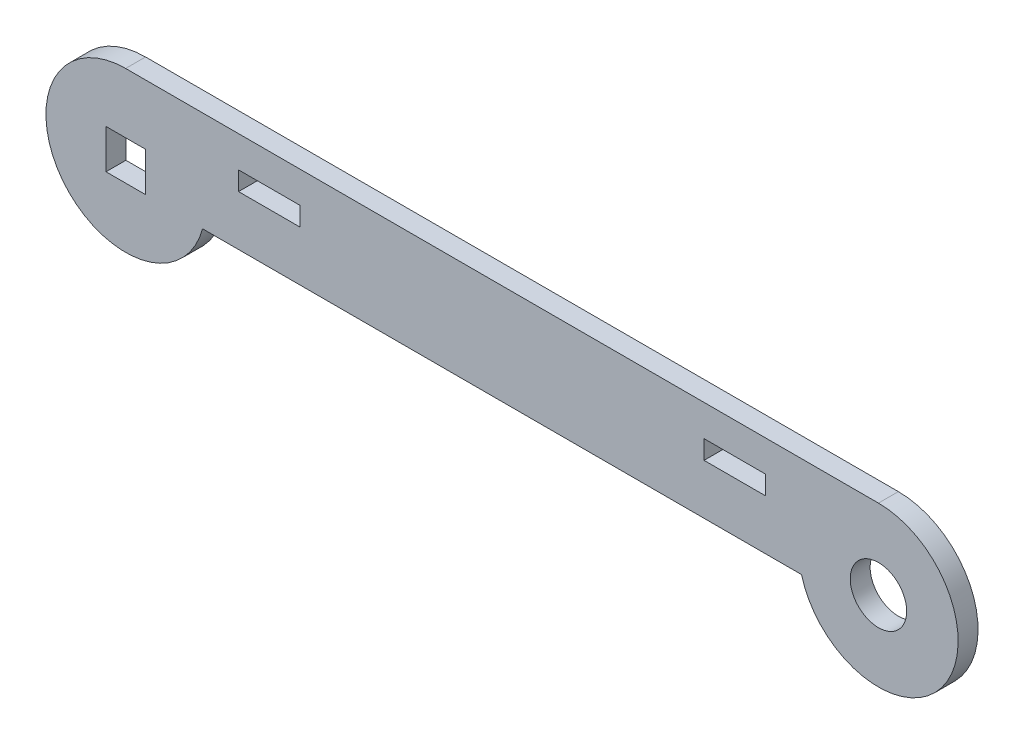
ISO-10303-21;
HEADER;
FILE_DESCRIPTION(('STEP AP214'),'2;1');
FILE_NAME('part.step','',(''),(''),'','','');
FILE_SCHEMA(('AUTOMOTIVE_DESIGN { 1 0 10303 214 1 1 1 1 }'));
ENDSEC;
DATA;
#1=APPLICATION_CONTEXT('core data for automotive mechanical design processes');
#2=APPLICATION_PROTOCOL_DEFINITION('international standard','automotive_design',2000,#1);
#3=PRODUCT_CONTEXT('',#1,'mechanical');
#4=PRODUCT('Part','Part','',(#3));
#5=PRODUCT_RELATED_PRODUCT_CATEGORY('part','',(#4));
#6=PRODUCT_DEFINITION_FORMATION('','',#4);
#7=PRODUCT_DEFINITION_CONTEXT('part definition',#1,'design');
#8=PRODUCT_DEFINITION('design','',#6,#7);
#9=PRODUCT_DEFINITION_SHAPE('','',#8);
#10=(LENGTH_UNIT() NAMED_UNIT(*) SI_UNIT(.MILLI.,.METRE.));
#11=(NAMED_UNIT(*) PLANE_ANGLE_UNIT() SI_UNIT($,.RADIAN.));
#12=(NAMED_UNIT(*) SI_UNIT($,.STERADIAN.) SOLID_ANGLE_UNIT());
#13=UNCERTAINTY_MEASURE_WITH_UNIT(LENGTH_MEASURE(1.E-05),#10,'distance_accuracy_value','');
#14=(GEOMETRIC_REPRESENTATION_CONTEXT(3) GLOBAL_UNCERTAINTY_ASSIGNED_CONTEXT((#13)) GLOBAL_UNIT_ASSIGNED_CONTEXT((#10,
#11,#12)) REPRESENTATION_CONTEXT('',''));
#15=CARTESIAN_POINT('',(0.,0.,0.));
#16=DIRECTION('',(0.,0.,1.));
#17=DIRECTION('',(1.,0.,0.));
#18=AXIS2_PLACEMENT_3D('',#15,#16,#17);
#19=CARTESIAN_POINT('',(1.565,0.,1.5875));
#20=DIRECTION('',(-1.,0.,0.));
#21=DIRECTION('',(0.,0.,1.));
#22=AXIS2_PLACEMENT_3D('',#19,#20,#21);
#23=PLANE('',#22);
#24=DIRECTION('',(0.,1.,0.));
#25=VECTOR('',#24,1.);
#26=CARTESIAN_POINT('',(1.565,0.,0.));
#27=LINE('',#26,#25);
#28=CARTESIAN_POINT('',(1.565,-1.565,0.));
#29=VERTEX_POINT('',#28);
#30=CARTESIAN_POINT('',(1.565,1.565,0.));
#31=VERTEX_POINT('',#30);
#32=EDGE_CURVE('E225',#29,#31,#27,.T.);
#33=ORIENTED_EDGE('',*,*,#32,.F.);
#34=DIRECTION('',(0.,0.,-1.));
#35=VECTOR('',#34,1.);
#36=CARTESIAN_POINT('',(1.565,-1.565,1.5875));
#37=LINE('',#36,#35);
#38=CARTESIAN_POINT('',(1.565,-1.565,1.5875));
#39=VERTEX_POINT('',#38);
#40=EDGE_CURVE('E11',#39,#29,#37,.T.);
#41=ORIENTED_EDGE('',*,*,#40,.F.);
#42=DIRECTION('',(0.,1.,0.));
#43=VECTOR('',#42,1.);
#44=CARTESIAN_POINT('',(1.565,0.,1.5875));
#45=LINE('',#44,#43);
#46=CARTESIAN_POINT('',(1.565,1.565,1.5875));
#47=VERTEX_POINT('',#46);
#48=EDGE_CURVE('E179',#39,#47,#45,.T.);
#49=ORIENTED_EDGE('',*,*,#48,.T.);
#50=DIRECTION('',(0.,0.,-1.));
#51=VECTOR('',#50,1.);
#52=CARTESIAN_POINT('',(1.565,1.565,1.5875));
#53=LINE('',#52,#51);
#54=EDGE_CURVE('E115',#47,#31,#53,.T.);
#55=ORIENTED_EDGE('',*,*,#54,.T.);
#56=EDGE_LOOP('',(#33,#41,#49,#55));
#57=FACE_BOUND('',#56,.T.);
#58=ADVANCED_FACE('F37',(#57),#23,.T.);
#59=CARTESIAN_POINT('',(0.,-1.565,1.5875));
#60=DIRECTION('',(0.,1.,0.));
#61=DIRECTION('',(0.,0.,1.));
#62=AXIS2_PLACEMENT_3D('',#59,#60,#61);
#63=PLANE('',#62);
#64=DIRECTION('',(1.,0.,0.));
#65=VECTOR('',#64,1.);
#66=CARTESIAN_POINT('',(0.,-1.565,0.));
#67=LINE('',#66,#65);
#68=CARTESIAN_POINT('',(-1.565,-1.565,0.));
#69=VERTEX_POINT('',#68);
#70=EDGE_CURVE('E168',#69,#29,#67,.T.);
#71=ORIENTED_EDGE('',*,*,#70,.F.);
#72=DIRECTION('',(0.,0.,-1.));
#73=VECTOR('',#72,1.);
#74=CARTESIAN_POINT('',(-1.565,-1.565,1.5875));
#75=LINE('',#74,#73);
#76=CARTESIAN_POINT('',(-1.565,-1.565,1.5875));
#77=VERTEX_POINT('',#76);
#78=EDGE_CURVE('E47',#77,#69,#75,.T.);
#79=ORIENTED_EDGE('',*,*,#78,.F.);
#80=DIRECTION('',(1.,0.,0.));
#81=VECTOR('',#80,1.);
#82=CARTESIAN_POINT('',(0.,-1.565,1.5875));
#83=LINE('',#82,#81);
#84=EDGE_CURVE('E166',#77,#39,#83,.T.);
#85=ORIENTED_EDGE('',*,*,#84,.T.);
#86=ORIENTED_EDGE('',*,*,#40,.T.);
#87=EDGE_LOOP('',(#71,#79,#85,#86));
#88=FACE_BOUND('',#87,.T.);
#89=ADVANCED_FACE('F164',(#88),#63,.T.);
#90=CARTESIAN_POINT('',(-1.565,0.,1.5875));
#91=DIRECTION('',(-1.,0.,0.));
#92=DIRECTION('',(0.,0.,1.));
#93=AXIS2_PLACEMENT_3D('',#90,#91,#92);
#94=PLANE('',#93);
#95=DIRECTION('',(0.,1.,0.));
#96=VECTOR('',#95,1.);
#97=CARTESIAN_POINT('',(-1.565,0.,0.));
#98=LINE('',#97,#96);
#99=CARTESIAN_POINT('',(-1.565,1.565,0.));
#100=VERTEX_POINT('',#99);
#101=EDGE_CURVE('E228',#69,#100,#98,.T.);
#102=ORIENTED_EDGE('',*,*,#101,.T.);
#103=DIRECTION('',(0.,0.,-1.));
#104=VECTOR('',#103,1.);
#105=CARTESIAN_POINT('',(-1.565,1.565,1.5875));
#106=LINE('',#105,#104);
#107=CARTESIAN_POINT('',(-1.565,1.565,1.5875));
#108=VERTEX_POINT('',#107);
#109=EDGE_CURVE('E171',#108,#100,#106,.T.);
#110=ORIENTED_EDGE('',*,*,#109,.F.);
#111=DIRECTION('',(0.,1.,0.));
#112=VECTOR('',#111,1.);
#113=CARTESIAN_POINT('',(-1.565,0.,1.5875));
#114=LINE('',#113,#112);
#115=EDGE_CURVE('E174',#77,#108,#114,.T.);
#116=ORIENTED_EDGE('',*,*,#115,.F.);
#117=ORIENTED_EDGE('',*,*,#78,.T.);
#118=EDGE_LOOP('',(#102,#110,#116,#117));
#119=FACE_BOUND('',#118,.T.);
#120=ADVANCED_FACE('F175',(#119),#94,.F.);
#121=CARTESIAN_POINT('',(0.,3.84999999999999,1.5875));
#122=DIRECTION('',(0.,-1.,0.));
#123=DIRECTION('',(1.,0.,0.));
#124=AXIS2_PLACEMENT_3D('',#121,#122,#123);
#125=PLANE('',#124);
#126=DIRECTION('',(-1.,0.,0.));
#127=VECTOR('',#126,1.);
#128=CARTESIAN_POINT('',(0.,3.84999999999999,0.));
#129=LINE('',#128,#127);
#130=CARTESIAN_POINT('',(51.,3.85,0.));
#131=VERTEX_POINT('',#130);
#132=CARTESIAN_POINT('',(46.1,3.85,0.));
#133=VERTEX_POINT('',#132);
#134=EDGE_CURVE('E213',#131,#133,#129,.T.);
#135=ORIENTED_EDGE('',*,*,#134,.F.);
#136=DIRECTION('',(0.,0.,-1.));
#137=VECTOR('',#136,1.);
#138=CARTESIAN_POINT('',(51.,3.85,1.5875));
#139=LINE('',#138,#137);
#140=CARTESIAN_POINT('',(51.,3.85,1.5875));
#141=VERTEX_POINT('',#140);
#142=EDGE_CURVE('E236',#141,#131,#139,.T.);
#143=ORIENTED_EDGE('',*,*,#142,.F.);
#144=DIRECTION('',(-1.,0.,0.));
#145=VECTOR('',#144,1.);
#146=CARTESIAN_POINT('',(0.,3.84999999999999,1.5875));
#147=LINE('',#146,#145);
#148=CARTESIAN_POINT('',(46.1,3.85,1.5875));
#149=VERTEX_POINT('',#148);
#150=EDGE_CURVE('E297',#141,#149,#147,.T.);
#151=ORIENTED_EDGE('',*,*,#150,.T.);
#152=DIRECTION('',(0.,0.,-1.));
#153=VECTOR('',#152,1.);
#154=CARTESIAN_POINT('',(46.1,3.85,1.5875));
#155=LINE('',#154,#153);
#156=EDGE_CURVE('E238',#149,#133,#155,.T.);
#157=ORIENTED_EDGE('',*,*,#156,.T.);
#158=EDGE_LOOP('',(#135,#143,#151,#157));
#159=FACE_BOUND('',#158,.T.);
#160=ADVANCED_FACE('F315',(#159),#125,.T.);
#161=CARTESIAN_POINT('',(51.,0.,1.5875));
#162=DIRECTION('',(-1.,0.,0.));
#163=DIRECTION('',(0.,0.,1.));
#164=AXIS2_PLACEMENT_3D('',#161,#162,#163);
#165=PLANE('',#164);
#166=DIRECTION('',(0.,1.,0.));
#167=VECTOR('',#166,1.);
#168=CARTESIAN_POINT('',(51.,0.,0.));
#169=LINE('',#168,#167);
#170=CARTESIAN_POINT('',(51.,2.35,0.));
#171=VERTEX_POINT('',#170);
#172=EDGE_CURVE('E216',#171,#131,#169,.T.);
#173=ORIENTED_EDGE('',*,*,#172,.F.);
#174=DIRECTION('',(0.,0.,-1.));
#175=VECTOR('',#174,1.);
#176=CARTESIAN_POINT('',(51.,2.35,1.5875));
#177=LINE('',#176,#175);
#178=CARTESIAN_POINT('',(51.,2.35,1.5875));
#179=VERTEX_POINT('',#178);
#180=EDGE_CURVE('E244',#179,#171,#177,.T.);
#181=ORIENTED_EDGE('',*,*,#180,.F.);
#182=DIRECTION('',(0.,1.,0.));
#183=VECTOR('',#182,1.);
#184=CARTESIAN_POINT('',(51.,0.,1.5875));
#185=LINE('',#184,#183);
#186=EDGE_CURVE('E300',#179,#141,#185,.T.);
#187=ORIENTED_EDGE('',*,*,#186,.T.);
#188=ORIENTED_EDGE('',*,*,#142,.T.);
#189=EDGE_LOOP('',(#173,#181,#187,#188));
#190=FACE_BOUND('',#189,.T.);
#191=ADVANCED_FACE('F318',(#190),#165,.T.);
#192=CARTESIAN_POINT('',(0.,2.34999999999999,1.5875));
#193=DIRECTION('',(0.,-1.,0.));
#194=DIRECTION('',(1.,0.,0.));
#195=AXIS2_PLACEMENT_3D('',#192,#193,#194);
#196=PLANE('',#195);
#197=DIRECTION('',(-1.,0.,0.));
#198=VECTOR('',#197,1.);
#199=CARTESIAN_POINT('',(0.,2.34999999999999,0.));
#200=LINE('',#199,#198);
#201=CARTESIAN_POINT('',(46.1,2.35,0.));
#202=VERTEX_POINT('',#201);
#203=EDGE_CURVE('E219',#171,#202,#200,.T.);
#204=ORIENTED_EDGE('',*,*,#203,.T.);
#205=DIRECTION('',(0.,0.,-1.));
#206=VECTOR('',#205,1.);
#207=CARTESIAN_POINT('',(46.1,2.35,1.5875));
#208=LINE('',#207,#206);
#209=CARTESIAN_POINT('',(46.1,2.35,1.5875));
#210=VERTEX_POINT('',#209);
#211=EDGE_CURVE('E240',#210,#202,#208,.T.);
#212=ORIENTED_EDGE('',*,*,#211,.F.);
#213=DIRECTION('',(-1.,0.,0.));
#214=VECTOR('',#213,1.);
#215=CARTESIAN_POINT('',(0.,2.34999999999999,1.5875));
#216=LINE('',#215,#214);
#217=EDGE_CURVE('E303',#179,#210,#216,.T.);
#218=ORIENTED_EDGE('',*,*,#217,.F.);
#219=ORIENTED_EDGE('',*,*,#180,.T.);
#220=EDGE_LOOP('',(#204,#212,#218,#219));
#221=FACE_BOUND('',#220,.T.);
#222=ADVANCED_FACE('F321',(#221),#196,.F.);
#223=CARTESIAN_POINT('',(13.9,0.,1.5875));
#224=DIRECTION('',(-1.,0.,0.));
#225=DIRECTION('',(0.,0.,1.));
#226=AXIS2_PLACEMENT_3D('',#223,#224,#225);
#227=PLANE('',#226);
#228=DIRECTION('',(0.,1.,0.));
#229=VECTOR('',#228,1.);
#230=CARTESIAN_POINT('',(13.9,0.,0.));
#231=LINE('',#230,#229);
#232=CARTESIAN_POINT('',(13.9,2.35,0.));
#233=VERTEX_POINT('',#232);
#234=CARTESIAN_POINT('',(13.9,3.85,0.));
#235=VERTEX_POINT('',#234);
#236=EDGE_CURVE('E201',#233,#235,#231,.T.);
#237=ORIENTED_EDGE('',*,*,#236,.F.);
#238=DIRECTION('',(0.,0.,-1.));
#239=VECTOR('',#238,1.);
#240=CARTESIAN_POINT('',(13.9,2.35,1.5875));
#241=LINE('',#240,#239);
#242=CARTESIAN_POINT('',(13.9,2.35,1.5875));
#243=VERTEX_POINT('',#242);
#244=EDGE_CURVE('E241',#243,#233,#241,.T.);
#245=ORIENTED_EDGE('',*,*,#244,.F.);
#246=DIRECTION('',(0.,1.,0.));
#247=VECTOR('',#246,1.);
#248=CARTESIAN_POINT('',(13.9,0.,1.5875));
#249=LINE('',#248,#247);
#250=CARTESIAN_POINT('',(13.9,3.85,1.5875));
#251=VERTEX_POINT('',#250);
#252=EDGE_CURVE('E280',#243,#251,#249,.T.);
#253=ORIENTED_EDGE('',*,*,#252,.T.);
#254=DIRECTION('',(0.,0.,-1.));
#255=VECTOR('',#254,1.);
#256=CARTESIAN_POINT('',(13.9,3.85,1.5875));
#257=LINE('',#256,#255);
#258=EDGE_CURVE('E247',#251,#235,#257,.T.);
#259=ORIENTED_EDGE('',*,*,#258,.T.);
#260=EDGE_LOOP('',(#237,#245,#253,#259));
#261=FACE_BOUND('',#260,.T.);
#262=ADVANCED_FACE('F353',(#261),#227,.T.);
#263=CARTESIAN_POINT('',(0.,2.35,1.5875));
#264=DIRECTION('',(0.,1.,0.));
#265=DIRECTION('',(0.,0.,1.));
#266=AXIS2_PLACEMENT_3D('',#263,#264,#265);
#267=PLANE('',#266);
#268=DIRECTION('',(1.,0.,0.));
#269=VECTOR('',#268,1.);
#270=CARTESIAN_POINT('',(0.,2.35,0.));
#271=LINE('',#270,#269);
#272=CARTESIAN_POINT('',(9.,2.35,0.));
#273=VERTEX_POINT('',#272);
#274=EDGE_CURVE('E204',#273,#233,#271,.T.);
#275=ORIENTED_EDGE('',*,*,#274,.F.);
#276=DIRECTION('',(0.,0.,-1.));
#277=VECTOR('',#276,1.);
#278=CARTESIAN_POINT('',(9.,2.35,1.5875));
#279=LINE('',#278,#277);
#280=CARTESIAN_POINT('',(9.,2.35,1.5875));
#281=VERTEX_POINT('',#280);
#282=EDGE_CURVE('E252',#281,#273,#279,.T.);
#283=ORIENTED_EDGE('',*,*,#282,.F.);
#284=DIRECTION('',(1.,0.,0.));
#285=VECTOR('',#284,1.);
#286=CARTESIAN_POINT('',(0.,2.35,1.5875));
#287=LINE('',#286,#285);
#288=EDGE_CURVE('E289',#281,#243,#287,.T.);
#289=ORIENTED_EDGE('',*,*,#288,.T.);
#290=ORIENTED_EDGE('',*,*,#244,.T.);
#291=EDGE_LOOP('',(#275,#283,#289,#290));
#292=FACE_BOUND('',#291,.T.);
#293=ADVANCED_FACE('F364',(#292),#267,.T.);
#294=CARTESIAN_POINT('',(9.,0.,1.5875));
#295=DIRECTION('',(-1.,0.,0.));
#296=DIRECTION('',(0.,0.,1.));
#297=AXIS2_PLACEMENT_3D('',#294,#295,#296);
#298=PLANE('',#297);
#299=DIRECTION('',(0.,1.,0.));
#300=VECTOR('',#299,1.);
#301=CARTESIAN_POINT('',(9.,0.,0.));
#302=LINE('',#301,#300);
#303=CARTESIAN_POINT('',(9.,3.85,0.));
#304=VERTEX_POINT('',#303);
#305=EDGE_CURVE('E207',#273,#304,#302,.T.);
#306=ORIENTED_EDGE('',*,*,#305,.T.);
#307=DIRECTION('',(0.,0.,-1.));
#308=VECTOR('',#307,1.);
#309=CARTESIAN_POINT('',(9.,3.85,1.5875));
#310=LINE('',#309,#308);
#311=CARTESIAN_POINT('',(9.,3.85,1.5875));
#312=VERTEX_POINT('',#311);
#313=EDGE_CURVE('E249',#312,#304,#310,.T.);
#314=ORIENTED_EDGE('',*,*,#313,.F.);
#315=DIRECTION('',(0.,1.,0.));
#316=VECTOR('',#315,1.);
#317=CARTESIAN_POINT('',(9.,0.,1.5875));
#318=LINE('',#317,#316);
#319=EDGE_CURVE('E292',#281,#312,#318,.T.);
#320=ORIENTED_EDGE('',*,*,#319,.F.);
#321=ORIENTED_EDGE('',*,*,#282,.T.);
#322=EDGE_LOOP('',(#306,#314,#320,#321));
#323=FACE_BOUND('',#322,.T.);
#324=ADVANCED_FACE('F361',(#323),#298,.F.);
#325=CARTESIAN_POINT('',(0.,-1.65,1.5875));
#326=DIRECTION('',(0.,1.,0.));
#327=DIRECTION('',(0.,0.,1.));
#328=AXIS2_PLACEMENT_3D('',#325,#326,#327);
#329=PLANE('',#328);
#330=DIRECTION('',(1.,0.,0.));
#331=VECTOR('',#330,1.);
#332=CARTESIAN_POINT('',(0.,-1.65,0.));
#333=LINE('',#332,#331);
#334=CARTESIAN_POINT('',(6.13188388670236,-1.65,0.));
#335=VERTEX_POINT('',#334);
#336=CARTESIAN_POINT('',(53.8681161132976,-1.65,0.));
#337=VERTEX_POINT('',#336);
#338=EDGE_CURVE('E190',#335,#337,#333,.T.);
#339=ORIENTED_EDGE('',*,*,#338,.T.);
#340=DIRECTION('',(0.,0.,-1.));
#341=VECTOR('',#340,1.);
#342=CARTESIAN_POINT('',(53.8681161132976,-1.65,1.5875));
#343=LINE('',#342,#341);
#344=CARTESIAN_POINT('',(53.8681161132976,-1.65,1.5875));
#345=VERTEX_POINT('',#344);
#346=EDGE_CURVE('E41',#345,#337,#343,.T.);
#347=ORIENTED_EDGE('',*,*,#346,.F.);
#348=DIRECTION('',(1.,0.,0.));
#349=VECTOR('',#348,1.);
#350=CARTESIAN_POINT('',(0.,-1.65,1.5875));
#351=LINE('',#350,#349);
#352=CARTESIAN_POINT('',(6.13188388670236,-1.65,1.5875));
#353=VERTEX_POINT('',#352);
#354=EDGE_CURVE('E234',#353,#345,#351,.T.);
#355=ORIENTED_EDGE('',*,*,#354,.F.);
#356=DIRECTION('',(0.,0.,-1.));
#357=VECTOR('',#356,1.);
#358=CARTESIAN_POINT('',(6.13188388670236,-1.65,1.5875));
#359=LINE('',#358,#357);
#360=EDGE_CURVE('E189',#353,#335,#359,.T.);
#361=ORIENTED_EDGE('',*,*,#360,.T.);
#362=EDGE_LOOP('',(#339,#347,#355,#361));
#363=FACE_BOUND('',#362,.T.);
#364=ADVANCED_FACE('F39',(#363),#329,.F.);
#365=CARTESIAN_POINT('',(60.,0.,1.5875));
#366=DIRECTION('',(0.,0.,-1.));
#367=DIRECTION('',(-1.,0.,0.));
#368=AXIS2_PLACEMENT_3D('',#365,#366,#367);
#369=CYLINDRICAL_SURFACE('',#368,6.35);
#370=CARTESIAN_POINT('',(60.,0.,0.));
#371=DIRECTION('',(0.,0.,1.));
#372=DIRECTION('',(1.,0.,0.));
#373=AXIS2_PLACEMENT_3D('',#370,#371,#372);
#374=CIRCLE('',#373,6.35);
#375=CARTESIAN_POINT('',(60.,6.35,0.));
#376=VERTEX_POINT('',#375);
#377=EDGE_CURVE('E193',#337,#376,#374,.T.);
#378=ORIENTED_EDGE('',*,*,#377,.T.);
#379=DIRECTION('',(0.,0.,-1.));
#380=VECTOR('',#379,1.);
#381=CARTESIAN_POINT('',(60.,6.35,1.5875));
#382=LINE('',#381,#380);
#383=CARTESIAN_POINT('',(60.,6.35,1.5875));
#384=VERTEX_POINT('',#383);
#385=EDGE_CURVE('E258',#384,#376,#382,.T.);
#386=ORIENTED_EDGE('',*,*,#385,.F.);
#387=CARTESIAN_POINT('',(60.,0.,1.5875));
#388=DIRECTION('',(0.,0.,1.));
#389=DIRECTION('',(1.,0.,0.));
#390=AXIS2_PLACEMENT_3D('',#387,#388,#389);
#391=CIRCLE('',#390,6.35);
#392=EDGE_CURVE('E123',#345,#384,#391,.T.);
#393=ORIENTED_EDGE('',*,*,#392,.F.);
#394=ORIENTED_EDGE('',*,*,#346,.T.);
#395=EDGE_LOOP('',(#378,#386,#393,#394));
#396=FACE_BOUND('',#395,.T.);
#397=ADVANCED_FACE('F263',(#396),#369,.T.);
#398=CARTESIAN_POINT('',(0.,6.35,1.5875));
#399=DIRECTION('',(0.,1.,0.));
#400=DIRECTION('',(0.,0.,1.));
#401=AXIS2_PLACEMENT_3D('',#398,#399,#400);
#402=PLANE('',#401);
#403=DIRECTION('',(1.,0.,0.));
#404=VECTOR('',#403,1.);
#405=CARTESIAN_POINT('',(0.,6.35,0.));
#406=LINE('',#405,#404);
#407=CARTESIAN_POINT('',(0.,6.35,0.));
#408=VERTEX_POINT('',#407);
#409=EDGE_CURVE('E196',#408,#376,#406,.T.);
#410=ORIENTED_EDGE('',*,*,#409,.F.);
#411=DIRECTION('',(0.,0.,-1.));
#412=VECTOR('',#411,1.);
#413=CARTESIAN_POINT('',(0.,6.35,1.5875));
#414=LINE('',#413,#412);
#415=CARTESIAN_POINT('',(0.,6.35,1.5875));
#416=VERTEX_POINT('',#415);
#417=EDGE_CURVE('E257',#416,#408,#414,.T.);
#418=ORIENTED_EDGE('',*,*,#417,.F.);
#419=DIRECTION('',(1.,0.,0.));
#420=VECTOR('',#419,1.);
#421=CARTESIAN_POINT('',(0.,6.35,1.5875));
#422=LINE('',#421,#420);
#423=EDGE_CURVE('E275',#416,#384,#422,.T.);
#424=ORIENTED_EDGE('',*,*,#423,.T.);
#425=ORIENTED_EDGE('',*,*,#385,.T.);
#426=EDGE_LOOP('',(#410,#418,#424,#425));
#427=FACE_BOUND('',#426,.T.);
#428=ADVANCED_FACE('F272',(#427),#402,.T.);
#429=CARTESIAN_POINT('',(0.,1.565,1.5875));
#430=DIRECTION('',(0.,1.,0.));
#431=DIRECTION('',(0.,0.,1.));
#432=AXIS2_PLACEMENT_3D('',#429,#430,#431);
#433=PLANE('',#432);
#434=DIRECTION('',(1.,0.,0.));
#435=VECTOR('',#434,1.);
#436=CARTESIAN_POINT('',(0.,1.565,0.));
#437=LINE('',#436,#435);
#438=EDGE_CURVE('E108',#100,#31,#437,.T.);
#439=ORIENTED_EDGE('',*,*,#438,.T.);
#440=ORIENTED_EDGE('',*,*,#54,.F.);
#441=DIRECTION('',(1.,0.,0.));
#442=VECTOR('',#441,1.);
#443=CARTESIAN_POINT('',(0.,1.565,1.5875));
#444=LINE('',#443,#442);
#445=EDGE_CURVE('E56',#108,#47,#444,.T.);
#446=ORIENTED_EDGE('',*,*,#445,.F.);
#447=ORIENTED_EDGE('',*,*,#109,.T.);
#448=EDGE_LOOP('',(#439,#440,#446,#447));
#449=FACE_BOUND('',#448,.T.);
#450=ADVANCED_FACE('F350',(#449),#433,.F.);
#451=CARTESIAN_POINT('',(46.1,0.,1.5875));
#452=DIRECTION('',(-1.,0.,0.));
#453=DIRECTION('',(0.,0.,1.));
#454=AXIS2_PLACEMENT_3D('',#451,#452,#453);
#455=PLANE('',#454);
#456=DIRECTION('',(0.,1.,0.));
#457=VECTOR('',#456,1.);
#458=CARTESIAN_POINT('',(46.1,0.,0.));
#459=LINE('',#458,#457);
#460=EDGE_CURVE('E222',#202,#133,#459,.T.);
#461=ORIENTED_EDGE('',*,*,#460,.T.);
#462=ORIENTED_EDGE('',*,*,#156,.F.);
#463=DIRECTION('',(0.,1.,0.));
#464=VECTOR('',#463,1.);
#465=CARTESIAN_POINT('',(46.1,0.,1.5875));
#466=LINE('',#465,#464);
#467=EDGE_CURVE('E181',#210,#149,#466,.T.);
#468=ORIENTED_EDGE('',*,*,#467,.F.);
#469=ORIENTED_EDGE('',*,*,#211,.T.);
#470=EDGE_LOOP('',(#461,#462,#468,#469));
#471=FACE_BOUND('',#470,.T.);
#472=ADVANCED_FACE('F312',(#471),#455,.F.);
#473=CARTESIAN_POINT('',(0.,3.85,1.5875));
#474=DIRECTION('',(0.,1.,0.));
#475=DIRECTION('',(0.,0.,1.));
#476=AXIS2_PLACEMENT_3D('',#473,#474,#475);
#477=PLANE('',#476);
#478=DIRECTION('',(1.,0.,0.));
#479=VECTOR('',#478,1.);
#480=CARTESIAN_POINT('',(0.,3.85,0.));
#481=LINE('',#480,#479);
#482=EDGE_CURVE('E210',#304,#235,#481,.T.);
#483=ORIENTED_EDGE('',*,*,#482,.T.);
#484=ORIENTED_EDGE('',*,*,#258,.F.);
#485=DIRECTION('',(1.,0.,0.));
#486=VECTOR('',#485,1.);
#487=CARTESIAN_POINT('',(0.,3.85,1.5875));
#488=LINE('',#487,#486);
#489=EDGE_CURVE('E295',#312,#251,#488,.T.);
#490=ORIENTED_EDGE('',*,*,#489,.F.);
#491=ORIENTED_EDGE('',*,*,#313,.T.);
#492=EDGE_LOOP('',(#483,#484,#490,#491));
#493=FACE_BOUND('',#492,.T.);
#494=ADVANCED_FACE('F337',(#493),#477,.F.);
#495=CARTESIAN_POINT('',(0.,0.,1.5875));
#496=DIRECTION('',(0.,0.,-1.));
#497=DIRECTION('',(-1.,0.,0.));
#498=AXIS2_PLACEMENT_3D('',#495,#496,#497);
#499=CYLINDRICAL_SURFACE('',#498,6.35);
#500=CARTESIAN_POINT('',(0.,0.,0.));
#501=DIRECTION('',(0.,0.,1.));
#502=DIRECTION('',(1.,0.,0.));
#503=AXIS2_PLACEMENT_3D('',#500,#501,#502);
#504=CIRCLE('',#503,6.35);
#505=EDGE_CURVE('E199',#408,#335,#504,.T.);
#506=ORIENTED_EDGE('',*,*,#505,.T.);
#507=ORIENTED_EDGE('',*,*,#360,.F.);
#508=CARTESIAN_POINT('',(0.,0.,1.5875));
#509=DIRECTION('',(0.,0.,1.));
#510=DIRECTION('',(1.,0.,0.));
#511=AXIS2_PLACEMENT_3D('',#508,#509,#510);
#512=CIRCLE('',#511,6.35);
#513=EDGE_CURVE('E277',#416,#353,#512,.T.);
#514=ORIENTED_EDGE('',*,*,#513,.F.);
#515=ORIENTED_EDGE('',*,*,#417,.T.);
#516=EDGE_LOOP('',(#506,#507,#514,#515));
#517=FACE_BOUND('',#516,.T.);
#518=ADVANCED_FACE('F278',(#517),#499,.T.);
#519=CARTESIAN_POINT('',(60.,0.,1.5875));
#520=DIRECTION('',(0.,0.,-1.));
#521=DIRECTION('',(-1.,0.,0.));
#522=AXIS2_PLACEMENT_3D('',#519,#520,#521);
#523=CYLINDRICAL_SURFACE('',#522,2.25);
#524=CARTESIAN_POINT('',(60.,0.,1.5875));
#525=DIRECTION('',(0.,0.,1.));
#526=DIRECTION('',(1.,0.,0.));
#527=AXIS2_PLACEMENT_3D('',#524,#525,#526);
#528=CIRCLE('',#527,2.25);
#529=CARTESIAN_POINT('',(62.25,0.,1.5875));
#530=VERTEX_POINT('',#529);
#531=EDGE_CURVE('E186',#530,#530,#528,.T.);
#532=ORIENTED_EDGE('',*,*,#531,.T.);
#533=EDGE_LOOP('',(#532));
#534=FACE_BOUND('',#533,.T.);
#535=CARTESIAN_POINT('',(60.,0.,0.));
#536=DIRECTION('',(0.,0.,1.));
#537=DIRECTION('',(1.,0.,0.));
#538=AXIS2_PLACEMENT_3D('',#535,#536,#537);
#539=CIRCLE('',#538,2.25);
#540=CARTESIAN_POINT('',(62.25,0.,0.));
#541=VERTEX_POINT('',#540);
#542=EDGE_CURVE('E231',#541,#541,#539,.T.);
#543=ORIENTED_EDGE('',*,*,#542,.F.);
#544=EDGE_LOOP('',(#543));
#545=FACE_BOUND('',#544,.T.);
#546=ADVANCED_FACE('F328',(#534,#545),#523,.F.);
#547=CARTESIAN_POINT('',(0.,0.,1.5875));
#548=DIRECTION('',(0.,0.,1.));
#549=DIRECTION('',(1.,0.,0.));
#550=AXIS2_PLACEMENT_3D('',#547,#548,#549);
#551=PLANE('',#550);
#552=ORIENTED_EDGE('',*,*,#354,.T.);
#553=ORIENTED_EDGE('',*,*,#392,.T.);
#554=ORIENTED_EDGE('',*,*,#423,.F.);
#555=ORIENTED_EDGE('',*,*,#513,.T.);
#556=EDGE_LOOP('',(#552,#553,#554,#555));
#557=FACE_BOUND('',#556,.T.);
#558=ORIENTED_EDGE('',*,*,#252,.F.);
#559=ORIENTED_EDGE('',*,*,#288,.F.);
#560=ORIENTED_EDGE('',*,*,#319,.T.);
#561=ORIENTED_EDGE('',*,*,#489,.T.);
#562=EDGE_LOOP('',(#558,#559,#560,#561));
#563=FACE_BOUND('',#562,.T.);
#564=ORIENTED_EDGE('',*,*,#150,.F.);
#565=ORIENTED_EDGE('',*,*,#186,.F.);
#566=ORIENTED_EDGE('',*,*,#217,.T.);
#567=ORIENTED_EDGE('',*,*,#467,.T.);
#568=EDGE_LOOP('',(#564,#565,#566,#567));
#569=FACE_BOUND('',#568,.T.);
#570=ORIENTED_EDGE('',*,*,#48,.F.);
#571=ORIENTED_EDGE('',*,*,#84,.F.);
#572=ORIENTED_EDGE('',*,*,#115,.T.);
#573=ORIENTED_EDGE('',*,*,#445,.T.);
#574=EDGE_LOOP('',(#570,#571,#572,#573));
#575=FACE_BOUND('',#574,.T.);
#576=ORIENTED_EDGE('',*,*,#531,.F.);
#577=EDGE_LOOP('',(#576));
#578=FACE_BOUND('',#577,.T.);
#579=ADVANCED_FACE('F177',(#557,#563,#569,#575,#578),#551,.T.);
#580=CARTESIAN_POINT('',(0.,0.,0.));
#581=DIRECTION('',(0.,0.,1.));
#582=DIRECTION('',(1.,0.,0.));
#583=AXIS2_PLACEMENT_3D('',#580,#581,#582);
#584=PLANE('',#583);
#585=ORIENTED_EDGE('',*,*,#338,.F.);
#586=ORIENTED_EDGE('',*,*,#505,.F.);
#587=ORIENTED_EDGE('',*,*,#409,.T.);
#588=ORIENTED_EDGE('',*,*,#377,.F.);
#589=EDGE_LOOP('',(#585,#586,#587,#588));
#590=FACE_BOUND('',#589,.T.);
#591=ORIENTED_EDGE('',*,*,#236,.T.);
#592=ORIENTED_EDGE('',*,*,#482,.F.);
#593=ORIENTED_EDGE('',*,*,#305,.F.);
#594=ORIENTED_EDGE('',*,*,#274,.T.);
#595=EDGE_LOOP('',(#591,#592,#593,#594));
#596=FACE_BOUND('',#595,.T.);
#597=ORIENTED_EDGE('',*,*,#134,.T.);
#598=ORIENTED_EDGE('',*,*,#460,.F.);
#599=ORIENTED_EDGE('',*,*,#203,.F.);
#600=ORIENTED_EDGE('',*,*,#172,.T.);
#601=EDGE_LOOP('',(#597,#598,#599,#600));
#602=FACE_BOUND('',#601,.T.);
#603=ORIENTED_EDGE('',*,*,#32,.T.);
#604=ORIENTED_EDGE('',*,*,#438,.F.);
#605=ORIENTED_EDGE('',*,*,#101,.F.);
#606=ORIENTED_EDGE('',*,*,#70,.T.);
#607=EDGE_LOOP('',(#603,#604,#605,#606));
#608=FACE_BOUND('',#607,.T.);
#609=ORIENTED_EDGE('',*,*,#542,.T.);
#610=EDGE_LOOP('',(#609));
#611=FACE_BOUND('',#610,.T.);
#612=ADVANCED_FACE('F270',(#590,#596,#602,#608,#611),#584,.F.);
#613=CLOSED_SHELL('',(#58,#89,#120,#160,#191,#222,#262,#293,#324,#364,#397,#428,#450,#472,#494,
#518,#546,#579,#612));
#614=MANIFOLD_SOLID_BREP('B2',#613);
#615=ADVANCED_BREP_SHAPE_REPRESENTATION('',(#18,#614),#14);
#616=SHAPE_DEFINITION_REPRESENTATION(#9,#615);
ENDSEC;
END-ISO-10303-21;
